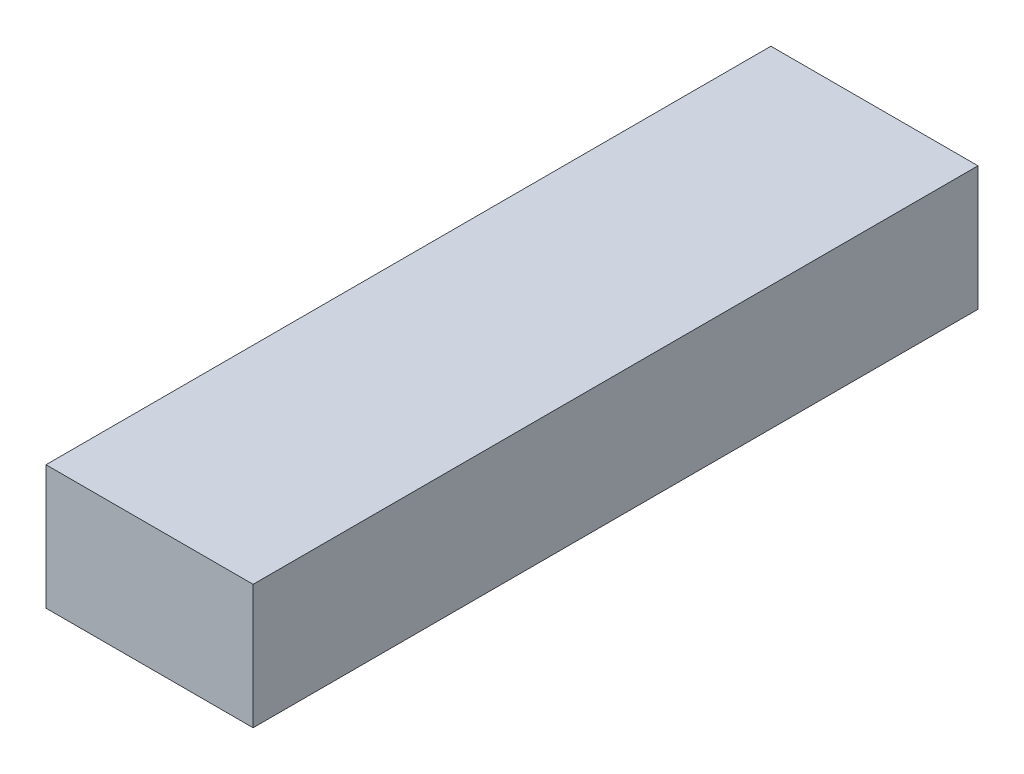
ISO-10303-21;
HEADER;
FILE_DESCRIPTION(('STEP AP214'),'2;1');
FILE_NAME('part.step','',(''),(''),'','','');
FILE_SCHEMA(('AUTOMOTIVE_DESIGN { 1 0 10303 214 1 1 1 1 }'));
ENDSEC;
DATA;
#1=APPLICATION_CONTEXT('core data for automotive mechanical design processes');
#2=APPLICATION_PROTOCOL_DEFINITION('international standard','automotive_design',2000,#1);
#3=PRODUCT_CONTEXT('',#1,'mechanical');
#4=PRODUCT('Part','Part','',(#3));
#5=PRODUCT_RELATED_PRODUCT_CATEGORY('part','',(#4));
#6=PRODUCT_DEFINITION_FORMATION('','',#4);
#7=PRODUCT_DEFINITION_CONTEXT('part definition',#1,'design');
#8=PRODUCT_DEFINITION('design','',#6,#7);
#9=PRODUCT_DEFINITION_SHAPE('','',#8);
#10=(LENGTH_UNIT() NAMED_UNIT(*) SI_UNIT(.MILLI.,.METRE.));
#11=(NAMED_UNIT(*) PLANE_ANGLE_UNIT() SI_UNIT($,.RADIAN.));
#12=(NAMED_UNIT(*) SI_UNIT($,.STERADIAN.) SOLID_ANGLE_UNIT());
#13=UNCERTAINTY_MEASURE_WITH_UNIT(LENGTH_MEASURE(1.E-05),#10,'distance_accuracy_value','');
#14=(GEOMETRIC_REPRESENTATION_CONTEXT(3) GLOBAL_UNCERTAINTY_ASSIGNED_CONTEXT((#13)) GLOBAL_UNIT_ASSIGNED_CONTEXT((#10,
#11,#12)) REPRESENTATION_CONTEXT('',''));
#15=CARTESIAN_POINT('',(0.,0.,0.));
#16=DIRECTION('',(0.,0.,1.));
#17=DIRECTION('',(1.,0.,0.));
#18=AXIS2_PLACEMENT_3D('',#15,#16,#17);
#19=CARTESIAN_POINT('',(-50.,30.,175.));
#20=DIRECTION('',(1.,0.,0.));
#21=DIRECTION('',(0.,1.,0.));
#22=AXIS2_PLACEMENT_3D('',#19,#20,#21);
#23=PLANE('',#22);
#24=DIRECTION('',(0.,-1.,0.));
#25=VECTOR('',#24,1.);
#26=CARTESIAN_POINT('',(-50.,30.,-175.));
#27=LINE('',#26,#25);
#28=CARTESIAN_POINT('',(-50.,30.,-175.));
#29=VERTEX_POINT('',#28);
#30=CARTESIAN_POINT('',(-50.,-30.,-175.));
#31=VERTEX_POINT('',#30);
#32=EDGE_CURVE('E96',#29,#31,#27,.T.);
#33=ORIENTED_EDGE('',*,*,#32,.T.);
#34=DIRECTION('',(0.,0.,-1.));
#35=VECTOR('',#34,1.);
#36=CARTESIAN_POINT('',(-50.,-30.,175.));
#37=LINE('',#36,#35);
#38=CARTESIAN_POINT('',(-50.,-30.,175.));
#39=VERTEX_POINT('',#38);
#40=EDGE_CURVE('E11',#39,#31,#37,.T.);
#41=ORIENTED_EDGE('',*,*,#40,.F.);
#42=DIRECTION('',(0.,-1.,0.));
#43=VECTOR('',#42,1.);
#44=CARTESIAN_POINT('',(-50.,30.,175.));
#45=LINE('',#44,#43);
#46=CARTESIAN_POINT('',(-50.,30.,175.));
#47=VERTEX_POINT('',#46);
#48=EDGE_CURVE('E84',#47,#39,#45,.T.);
#49=ORIENTED_EDGE('',*,*,#48,.F.);
#50=DIRECTION('',(0.,0.,-1.));
#51=VECTOR('',#50,1.);
#52=CARTESIAN_POINT('',(-50.,30.,175.));
#53=LINE('',#52,#51);
#54=EDGE_CURVE('E92',#47,#29,#53,.T.);
#55=ORIENTED_EDGE('',*,*,#54,.T.);
#56=EDGE_LOOP('',(#33,#41,#49,#55));
#57=FACE_BOUND('',#56,.T.);
#58=ADVANCED_FACE('F33',(#57),#23,.F.);
#59=CARTESIAN_POINT('',(50.,-30.,175.));
#60=DIRECTION('',(0.,1.,0.));
#61=DIRECTION('',(-1.,0.,0.));
#62=AXIS2_PLACEMENT_3D('',#59,#60,#61);
#63=PLANE('',#62);
#64=DIRECTION('',(1.,0.,0.));
#65=VECTOR('',#64,1.);
#66=CARTESIAN_POINT('',(50.,-30.,-175.));
#67=LINE('',#66,#65);
#68=CARTESIAN_POINT('',(50.,-30.,-175.));
#69=VERTEX_POINT('',#68);
#70=EDGE_CURVE('E88',#31,#69,#67,.T.);
#71=ORIENTED_EDGE('',*,*,#70,.T.);
#72=DIRECTION('',(0.,0.,-1.));
#73=VECTOR('',#72,1.);
#74=CARTESIAN_POINT('',(50.,-30.,175.));
#75=LINE('',#74,#73);
#76=CARTESIAN_POINT('',(50.,-30.,175.));
#77=VERTEX_POINT('',#76);
#78=EDGE_CURVE('E41',#77,#69,#75,.T.);
#79=ORIENTED_EDGE('',*,*,#78,.F.);
#80=DIRECTION('',(1.,0.,0.));
#81=VECTOR('',#80,1.);
#82=CARTESIAN_POINT('',(50.,-30.,175.));
#83=LINE('',#82,#81);
#84=EDGE_CURVE('E79',#39,#77,#83,.T.);
#85=ORIENTED_EDGE('',*,*,#84,.F.);
#86=ORIENTED_EDGE('',*,*,#40,.T.);
#87=EDGE_LOOP('',(#71,#79,#85,#86));
#88=FACE_BOUND('',#87,.T.);
#89=ADVANCED_FACE('F87',(#88),#63,.F.);
#90=CARTESIAN_POINT('',(50.,30.,175.));
#91=DIRECTION('',(-1.,0.,0.));
#92=DIRECTION('',(0.,-1.,0.));
#93=AXIS2_PLACEMENT_3D('',#90,#91,#92);
#94=PLANE('',#93);
#95=DIRECTION('',(0.,1.,0.));
#96=VECTOR('',#95,1.);
#97=CARTESIAN_POINT('',(50.,30.,-175.));
#98=LINE('',#97,#96);
#99=CARTESIAN_POINT('',(50.,30.,-175.));
#100=VERTEX_POINT('',#99);
#101=EDGE_CURVE('E66',#69,#100,#98,.T.);
#102=ORIENTED_EDGE('',*,*,#101,.T.);
#103=DIRECTION('',(0.,0.,-1.));
#104=VECTOR('',#103,1.);
#105=CARTESIAN_POINT('',(50.,30.,175.));
#106=LINE('',#105,#104);
#107=CARTESIAN_POINT('',(50.,30.,175.));
#108=VERTEX_POINT('',#107);
#109=EDGE_CURVE('E89',#108,#100,#106,.T.);
#110=ORIENTED_EDGE('',*,*,#109,.F.);
#111=DIRECTION('',(0.,1.,0.));
#112=VECTOR('',#111,1.);
#113=CARTESIAN_POINT('',(50.,30.,175.));
#114=LINE('',#113,#112);
#115=EDGE_CURVE('E82',#77,#108,#114,.T.);
#116=ORIENTED_EDGE('',*,*,#115,.F.);
#117=ORIENTED_EDGE('',*,*,#78,.T.);
#118=EDGE_LOOP('',(#102,#110,#116,#117));
#119=FACE_BOUND('',#118,.T.);
#120=ADVANCED_FACE('F90',(#119),#94,.F.);
#121=CARTESIAN_POINT('',(50.,30.,175.));
#122=DIRECTION('',(0.,-1.,0.));
#123=DIRECTION('',(1.,0.,0.));
#124=AXIS2_PLACEMENT_3D('',#121,#122,#123);
#125=PLANE('',#124);
#126=DIRECTION('',(-1.,0.,0.));
#127=VECTOR('',#126,1.);
#128=CARTESIAN_POINT('',(50.,30.,-175.));
#129=LINE('',#128,#127);
#130=EDGE_CURVE('E72',#100,#29,#129,.T.);
#131=ORIENTED_EDGE('',*,*,#130,.T.);
#132=ORIENTED_EDGE('',*,*,#54,.F.);
#133=DIRECTION('',(-1.,0.,0.));
#134=VECTOR('',#133,1.);
#135=CARTESIAN_POINT('',(50.,30.,175.));
#136=LINE('',#135,#134);
#137=EDGE_CURVE('E49',#108,#47,#136,.T.);
#138=ORIENTED_EDGE('',*,*,#137,.F.);
#139=ORIENTED_EDGE('',*,*,#109,.T.);
#140=EDGE_LOOP('',(#131,#132,#138,#139));
#141=FACE_BOUND('',#140,.T.);
#142=ADVANCED_FACE('F103',(#141),#125,.F.);
#143=CARTESIAN_POINT('',(0.,0.,175.));
#144=DIRECTION('',(0.,0.,-1.));
#145=DIRECTION('',(-1.,0.,0.));
#146=AXIS2_PLACEMENT_3D('',#143,#144,#145);
#147=PLANE('',#146);
#148=ORIENTED_EDGE('',*,*,#48,.T.);
#149=ORIENTED_EDGE('',*,*,#84,.T.);
#150=ORIENTED_EDGE('',*,*,#115,.T.);
#151=ORIENTED_EDGE('',*,*,#137,.T.);
#152=EDGE_LOOP('',(#148,#149,#150,#151));
#153=FACE_BOUND('',#152,.T.);
#154=ADVANCED_FACE('F80',(#153),#147,.F.);
#155=CARTESIAN_POINT('',(0.,0.,-175.));
#156=DIRECTION('',(0.,0.,-1.));
#157=DIRECTION('',(-1.,0.,0.));
#158=AXIS2_PLACEMENT_3D('',#155,#156,#157);
#159=PLANE('',#158);
#160=ORIENTED_EDGE('',*,*,#32,.F.);
#161=ORIENTED_EDGE('',*,*,#130,.F.);
#162=ORIENTED_EDGE('',*,*,#101,.F.);
#163=ORIENTED_EDGE('',*,*,#70,.F.);
#164=EDGE_LOOP('',(#160,#161,#162,#163));
#165=FACE_BOUND('',#164,.T.);
#166=ADVANCED_FACE('F106',(#165),#159,.T.);
#167=CLOSED_SHELL('',(#58,#89,#120,#142,#154,#166));
#168=MANIFOLD_SOLID_BREP('B2',#167);
#169=ADVANCED_BREP_SHAPE_REPRESENTATION('',(#18,#168),#14);
#170=SHAPE_DEFINITION_REPRESENTATION(#9,#169);
ENDSEC;
END-ISO-10303-21;
